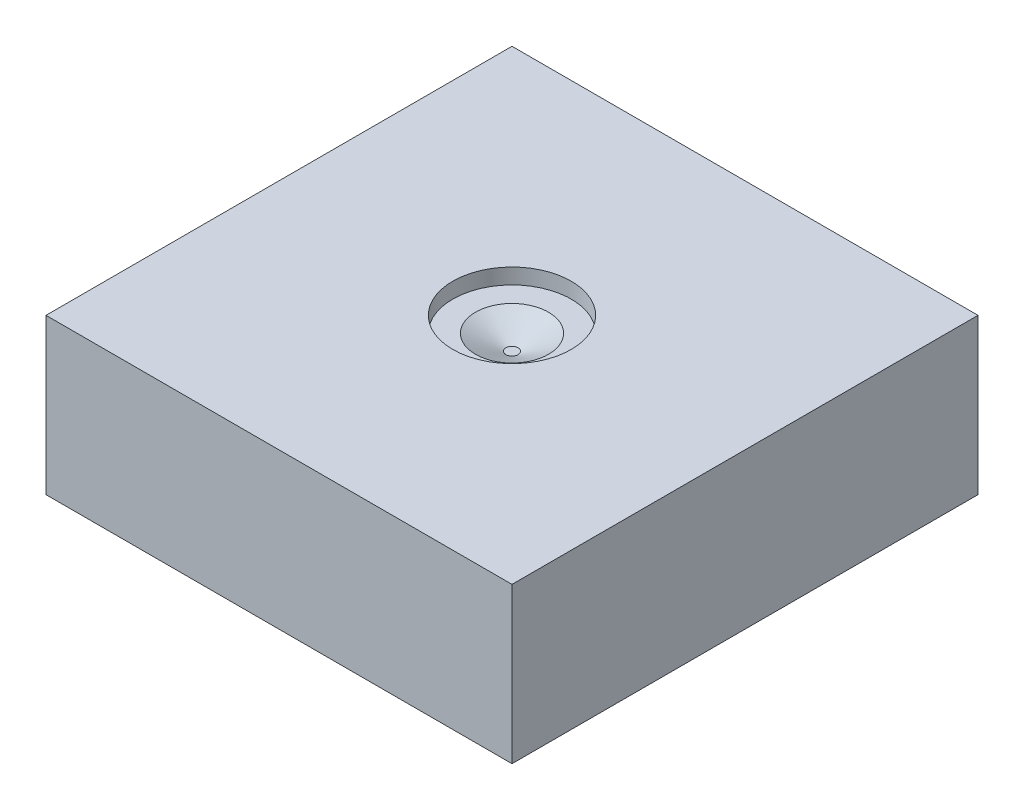
ISO-10303-21;
HEADER;
FILE_DESCRIPTION(('STEP AP214'),'2;1');
FILE_NAME('part.step','',(''),(''),'','','');
FILE_SCHEMA(('AUTOMOTIVE_DESIGN { 1 0 10303 214 1 1 1 1 }'));
ENDSEC;
DATA;
#1=APPLICATION_CONTEXT('core data for automotive mechanical design processes');
#2=APPLICATION_PROTOCOL_DEFINITION('international standard','automotive_design',2000,#1);
#3=PRODUCT_CONTEXT('',#1,'mechanical');
#4=PRODUCT('Part','Part','',(#3));
#5=PRODUCT_RELATED_PRODUCT_CATEGORY('part','',(#4));
#6=PRODUCT_DEFINITION_FORMATION('','',#4);
#7=PRODUCT_DEFINITION_CONTEXT('part definition',#1,'design');
#8=PRODUCT_DEFINITION('design','',#6,#7);
#9=PRODUCT_DEFINITION_SHAPE('','',#8);
#10=(LENGTH_UNIT() NAMED_UNIT(*) SI_UNIT(.MILLI.,.METRE.));
#11=(NAMED_UNIT(*) PLANE_ANGLE_UNIT() SI_UNIT($,.RADIAN.));
#12=(NAMED_UNIT(*) SI_UNIT($,.STERADIAN.) SOLID_ANGLE_UNIT());
#13=UNCERTAINTY_MEASURE_WITH_UNIT(LENGTH_MEASURE(1.E-05),#10,'distance_accuracy_value','');
#14=(GEOMETRIC_REPRESENTATION_CONTEXT(3) GLOBAL_UNCERTAINTY_ASSIGNED_CONTEXT((#13)) GLOBAL_UNIT_ASSIGNED_CONTEXT((#10,
#11,#12)) REPRESENTATION_CONTEXT('',''));
#15=CARTESIAN_POINT('',(0.,0.,0.));
#16=DIRECTION('',(0.,0.,1.));
#17=DIRECTION('',(1.,0.,0.));
#18=AXIS2_PLACEMENT_3D('',#15,#16,#17);
#19=CARTESIAN_POINT('',(-15.,10.,0.));
#20=DIRECTION('',(1.,0.,0.));
#21=DIRECTION('',(0.,0.,-1.));
#22=AXIS2_PLACEMENT_3D('',#19,#20,#21);
#23=PLANE('',#22);
#24=DIRECTION('',(0.,0.,1.));
#25=VECTOR('',#24,1.);
#26=CARTESIAN_POINT('',(-15.,0.,0.));
#27=LINE('',#26,#25);
#28=CARTESIAN_POINT('',(-15.,0.,-15.));
#29=VERTEX_POINT('',#28);
#30=CARTESIAN_POINT('',(-15.,0.,15.));
#31=VERTEX_POINT('',#30);
#32=EDGE_CURVE('E96',#29,#31,#27,.T.);
#33=ORIENTED_EDGE('',*,*,#32,.T.);
#34=DIRECTION('',(0.,-1.,0.));
#35=VECTOR('',#34,1.);
#36=CARTESIAN_POINT('',(-15.,10.,15.));
#37=LINE('',#36,#35);
#38=CARTESIAN_POINT('',(-15.,10.,15.));
#39=VERTEX_POINT('',#38);
#40=EDGE_CURVE('E11',#39,#31,#37,.T.);
#41=ORIENTED_EDGE('',*,*,#40,.F.);
#42=DIRECTION('',(0.,0.,1.));
#43=VECTOR('',#42,1.);
#44=CARTESIAN_POINT('',(-15.,10.,0.));
#45=LINE('',#44,#43);
#46=CARTESIAN_POINT('',(-15.,10.,-15.));
#47=VERTEX_POINT('',#46);
#48=EDGE_CURVE('E73',#47,#39,#45,.T.);
#49=ORIENTED_EDGE('',*,*,#48,.F.);
#50=DIRECTION('',(0.,-1.,0.));
#51=VECTOR('',#50,1.);
#52=CARTESIAN_POINT('',(-15.,10.,-15.));
#53=LINE('',#52,#51);
#54=EDGE_CURVE('E92',#47,#29,#53,.T.);
#55=ORIENTED_EDGE('',*,*,#54,.T.);
#56=EDGE_LOOP('',(#33,#41,#49,#55));
#57=FACE_BOUND('',#56,.T.);
#58=ADVANCED_FACE('F34',(#57),#23,.F.);
#59=CARTESIAN_POINT('',(0.,10.,15.));
#60=DIRECTION('',(0.,0.,1.));
#61=DIRECTION('',(1.,0.,0.));
#62=AXIS2_PLACEMENT_3D('',#59,#60,#61);
#63=PLANE('',#62);
#64=DIRECTION('',(-1.,0.,0.));
#65=VECTOR('',#64,1.);
#66=CARTESIAN_POINT('',(0.,0.,15.));
#67=LINE('',#66,#65);
#68=CARTESIAN_POINT('',(15.,0.,15.));
#69=VERTEX_POINT('',#68);
#70=EDGE_CURVE('E82',#69,#31,#67,.T.);
#71=ORIENTED_EDGE('',*,*,#70,.F.);
#72=DIRECTION('',(0.,-1.,0.));
#73=VECTOR('',#72,1.);
#74=CARTESIAN_POINT('',(15.,10.,15.));
#75=LINE('',#74,#73);
#76=CARTESIAN_POINT('',(15.,10.,15.));
#77=VERTEX_POINT('',#76);
#78=EDGE_CURVE('E42',#77,#69,#75,.T.);
#79=ORIENTED_EDGE('',*,*,#78,.F.);
#80=DIRECTION('',(-1.,0.,0.));
#81=VECTOR('',#80,1.);
#82=CARTESIAN_POINT('',(0.,10.,15.));
#83=LINE('',#82,#81);
#84=EDGE_CURVE('E80',#77,#39,#83,.T.);
#85=ORIENTED_EDGE('',*,*,#84,.T.);
#86=ORIENTED_EDGE('',*,*,#40,.T.);
#87=EDGE_LOOP('',(#71,#79,#85,#86));
#88=FACE_BOUND('',#87,.T.);
#89=ADVANCED_FACE('F79',(#88),#63,.T.);
#90=CARTESIAN_POINT('',(15.,10.,0.));
#91=DIRECTION('',(1.,0.,0.));
#92=DIRECTION('',(0.,0.,-1.));
#93=AXIS2_PLACEMENT_3D('',#90,#91,#92);
#94=PLANE('',#93);
#95=DIRECTION('',(0.,0.,1.));
#96=VECTOR('',#95,1.);
#97=CARTESIAN_POINT('',(15.,0.,0.));
#98=LINE('',#97,#96);
#99=CARTESIAN_POINT('',(15.,0.,-15.));
#100=VERTEX_POINT('',#99);
#101=EDGE_CURVE('E101',#100,#69,#98,.T.);
#102=ORIENTED_EDGE('',*,*,#101,.F.);
#103=DIRECTION('',(0.,-1.,0.));
#104=VECTOR('',#103,1.);
#105=CARTESIAN_POINT('',(15.,10.,-15.));
#106=LINE('',#105,#104);
#107=CARTESIAN_POINT('',(15.,10.,-15.));
#108=VERTEX_POINT('',#107);
#109=EDGE_CURVE('E65',#108,#100,#106,.T.);
#110=ORIENTED_EDGE('',*,*,#109,.F.);
#111=DIRECTION('',(0.,0.,1.));
#112=VECTOR('',#111,1.);
#113=CARTESIAN_POINT('',(15.,10.,0.));
#114=LINE('',#113,#112);
#115=EDGE_CURVE('E88',#108,#77,#114,.T.);
#116=ORIENTED_EDGE('',*,*,#115,.T.);
#117=ORIENTED_EDGE('',*,*,#78,.T.);
#118=EDGE_LOOP('',(#102,#110,#116,#117));
#119=FACE_BOUND('',#118,.T.);
#120=ADVANCED_FACE('F90',(#119),#94,.T.);
#121=CARTESIAN_POINT('',(0.,10.,-15.));
#122=DIRECTION('',(0.,0.,1.));
#123=DIRECTION('',(1.,0.,0.));
#124=AXIS2_PLACEMENT_3D('',#121,#122,#123);
#125=PLANE('',#124);
#126=DIRECTION('',(-1.,0.,0.));
#127=VECTOR('',#126,1.);
#128=CARTESIAN_POINT('',(0.,0.,-15.));
#129=LINE('',#128,#127);
#130=EDGE_CURVE('E68',#100,#29,#129,.T.);
#131=ORIENTED_EDGE('',*,*,#130,.T.);
#132=ORIENTED_EDGE('',*,*,#54,.F.);
#133=DIRECTION('',(-1.,0.,0.));
#134=VECTOR('',#133,1.);
#135=CARTESIAN_POINT('',(0.,10.,-15.));
#136=LINE('',#135,#134);
#137=EDGE_CURVE('E50',#108,#47,#136,.T.);
#138=ORIENTED_EDGE('',*,*,#137,.F.);
#139=ORIENTED_EDGE('',*,*,#109,.T.);
#140=EDGE_LOOP('',(#131,#132,#138,#139));
#141=FACE_BOUND('',#140,.T.);
#142=ADVANCED_FACE('F119',(#141),#125,.F.);
#143=CARTESIAN_POINT('',(0.,10.,0.));
#144=DIRECTION('',(0.,1.,0.));
#145=DIRECTION('',(0.,0.,1.));
#146=AXIS2_PLACEMENT_3D('',#143,#144,#145);
#147=PLANE('',#146);
#148=CARTESIAN_POINT('',(0.,10.,0.));
#149=DIRECTION('',(0.,1.,0.));
#150=DIRECTION('',(0.,0.,1.));
#151=AXIS2_PLACEMENT_3D('',#148,#149,#150);
#152=CIRCLE('',#151,3.81);
#153=CARTESIAN_POINT('',(0.,10.,3.81));
#154=VERTEX_POINT('',#153);
#155=EDGE_CURVE('E186',#154,#154,#152,.T.);
#156=ORIENTED_EDGE('',*,*,#155,.F.);
#157=EDGE_LOOP('',(#156));
#158=FACE_BOUND('',#157,.T.);
#159=ORIENTED_EDGE('',*,*,#48,.T.);
#160=ORIENTED_EDGE('',*,*,#84,.F.);
#161=ORIENTED_EDGE('',*,*,#115,.F.);
#162=ORIENTED_EDGE('',*,*,#137,.T.);
#163=EDGE_LOOP('',(#159,#160,#161,#162));
#164=FACE_BOUND('',#163,.T.);
#165=ADVANCED_FACE('F87',(#158,#164),#147,.T.);
#166=CARTESIAN_POINT('',(0.,0.,0.));
#167=DIRECTION('',(0.,1.,0.));
#168=DIRECTION('',(0.,0.,1.));
#169=AXIS2_PLACEMENT_3D('',#166,#167,#168);
#170=PLANE('',#169);
#171=ORIENTED_EDGE('',*,*,#32,.F.);
#172=ORIENTED_EDGE('',*,*,#130,.F.);
#173=ORIENTED_EDGE('',*,*,#101,.T.);
#174=ORIENTED_EDGE('',*,*,#70,.T.);
#175=EDGE_LOOP('',(#171,#172,#173,#174));
#176=FACE_BOUND('',#175,.T.);
#177=ADVANCED_FACE('F108',(#176),#170,.F.);
#178=CARTESIAN_POINT('',(0.,9.,0.));
#179=DIRECTION('',(0.,1.,0.));
#180=DIRECTION('',(0.,0.,1.));
#181=AXIS2_PLACEMENT_3D('',#178,#179,#180);
#182=CYLINDRICAL_SURFACE('',#181,3.81);
#183=CARTESIAN_POINT('',(0.,9.,0.));
#184=DIRECTION('',(0.,1.,0.));
#185=DIRECTION('',(0.,0.,1.));
#186=AXIS2_PLACEMENT_3D('',#183,#184,#185);
#187=CIRCLE('',#186,3.81);
#188=CARTESIAN_POINT('',(0.,9.,3.81));
#189=VERTEX_POINT('',#188);
#190=EDGE_CURVE('E99',#189,#189,#187,.T.);
#191=ORIENTED_EDGE('',*,*,#190,.F.);
#192=EDGE_LOOP('',(#191));
#193=FACE_BOUND('',#192,.T.);
#194=ORIENTED_EDGE('',*,*,#155,.T.);
#195=EDGE_LOOP('',(#194));
#196=FACE_BOUND('',#195,.T.);
#197=ADVANCED_FACE('F110',(#193,#196),#182,.F.);
#198=CARTESIAN_POINT('',(0.,9.,0.));
#199=DIRECTION('',(0.,1.,0.));
#200=DIRECTION('',(0.,0.,1.));
#201=AXIS2_PLACEMENT_3D('',#198,#199,#200);
#202=PLANE('',#201);
#203=CARTESIAN_POINT('',(0.,9.,0.));
#204=DIRECTION('',(0.,1.,0.));
#205=DIRECTION('',(0.,0.,1.));
#206=AXIS2_PLACEMENT_3D('',#203,#204,#205);
#207=CIRCLE('',#206,2.35);
#208=CARTESIAN_POINT('',(0.,9.,2.35));
#209=VERTEX_POINT('',#208);
#210=EDGE_CURVE('E187',#209,#209,#207,.T.);
#211=ORIENTED_EDGE('',*,*,#210,.F.);
#212=EDGE_LOOP('',(#211));
#213=FACE_BOUND('',#212,.T.);
#214=ORIENTED_EDGE('',*,*,#190,.T.);
#215=EDGE_LOOP('',(#214));
#216=FACE_BOUND('',#215,.T.);
#217=ADVANCED_FACE('F116',(#213,#216),#202,.T.);
#218=CARTESIAN_POINT('',(0.,9.,0.));
#219=DIRECTION('',(0.,1.,0.));
#220=DIRECTION('',(0.,0.,1.));
#221=AXIS2_PLACEMENT_3D('',#218,#219,#220);
#222=CONICAL_SURFACE('',#221,2.35,1.09955742875643);
#223=CARTESIAN_POINT('',(0.,8.,0.));
#224=DIRECTION('',(0.,1.,0.));
#225=DIRECTION('',(0.,0.,1.));
#226=AXIS2_PLACEMENT_3D('',#223,#224,#225);
#227=CIRCLE('',#226,0.387389494494836);
#228=CARTESIAN_POINT('',(0.,8.,0.387389494494835));
#229=VERTEX_POINT('',#228);
#230=EDGE_CURVE('E185',#229,#229,#227,.T.);
#231=CARTESIAN_POINT('',(0.,8.,0.387389494494835));
#232=CARTESIAN_POINT('',(0.,8.01041666666667,0.40783335392718));
#233=CARTESIAN_POINT('',(0.,8.02083333333333,0.428277213359525));
#234=CARTESIAN_POINT('',(0.,8.04166666666667,0.469164932224216));
#235=CARTESIAN_POINT('',(0.,8.05208333333333,0.489608791656562));
#236=CARTESIAN_POINT('',(0.,8.07291666666667,0.530496510521253));
#237=CARTESIAN_POINT('',(0.,8.08333333333333,0.550940369953598));
#238=CARTESIAN_POINT('',(0.,8.10416666666667,0.591828088818289));
#239=CARTESIAN_POINT('',(0.,8.11458333333333,0.612271948250635));
#240=CARTESIAN_POINT('',(0.,8.13541666666667,0.653159667115325));
#241=CARTESIAN_POINT('',(0.,8.14583333333333,0.673603526547671));
#242=CARTESIAN_POINT('',(0.,8.16666666666667,0.714491245412362));
#243=CARTESIAN_POINT('',(0.,8.17708333333333,0.734935104844707));
#244=CARTESIAN_POINT('',(0.,8.19791666666667,0.775822823709398));
#245=CARTESIAN_POINT('',(0.,8.20833333333333,0.796266683141744));
#246=CARTESIAN_POINT('',(0.,8.22916666666667,0.837154402006435));
#247=CARTESIAN_POINT('',(0.,8.23958333333333,0.85759826143878));
#248=CARTESIAN_POINT('',(0.,8.26041666666667,0.898485980303471));
#249=CARTESIAN_POINT('',(0.,8.27083333333333,0.918929839735816));
#250=CARTESIAN_POINT('',(0.,8.29166666666667,0.959817558600507));
#251=CARTESIAN_POINT('',(0.,8.30208333333333,0.980261418032853));
#252=CARTESIAN_POINT('',(0.,8.32291666666667,1.02114913689754));
#253=CARTESIAN_POINT('',(0.,8.33333333333333,1.04159299632989));
#254=CARTESIAN_POINT('',(0.,8.35416666666667,1.08248071519458));
#255=CARTESIAN_POINT('',(0.,8.36458333333333,1.10292457462693));
#256=CARTESIAN_POINT('',(0.,8.38541666666667,1.14381229349162));
#257=CARTESIAN_POINT('',(0.,8.39583333333333,1.16425615292396));
#258=CARTESIAN_POINT('',(0.,8.41666666666667,1.20514387178865));
#259=CARTESIAN_POINT('',(0.,8.42708333333333,1.225587731221));
#260=CARTESIAN_POINT('',(0.,8.44791666666667,1.26647545008569));
#261=CARTESIAN_POINT('',(0.,8.45833333333333,1.28691930951803));
#262=CARTESIAN_POINT('',(0.,8.47916666666667,1.32780702838273));
#263=CARTESIAN_POINT('',(0.,8.48958333333333,1.34825088781507));
#264=CARTESIAN_POINT('',(0.,8.51041666666667,1.38913860667976));
#265=CARTESIAN_POINT('',(0.,8.52083333333333,1.40958246611211));
#266=CARTESIAN_POINT('',(0.,8.54166666666667,1.4504701849768));
#267=CARTESIAN_POINT('',(0.,8.55208333333333,1.47091404440914));
#268=CARTESIAN_POINT('',(0.,8.57291666666667,1.51180176327383));
#269=CARTESIAN_POINT('',(0.,8.58333333333333,1.53224562270618));
#270=CARTESIAN_POINT('',(0.,8.60416666666667,1.57313334157087));
#271=CARTESIAN_POINT('',(0.,8.61458333333333,1.59357720100322));
#272=CARTESIAN_POINT('',(0.,8.63541666666667,1.63446491986791));
#273=CARTESIAN_POINT('',(0.,8.64583333333333,1.65490877930025));
#274=CARTESIAN_POINT('',(0.,8.66666666666667,1.69579649816494));
#275=CARTESIAN_POINT('',(0.,8.67708333333333,1.71624035759729));
#276=CARTESIAN_POINT('',(0.,8.69791666666667,1.75712807646198));
#277=CARTESIAN_POINT('',(0.,8.70833333333333,1.77757193589433));
#278=CARTESIAN_POINT('',(0.,8.72916666666667,1.81845965475902));
#279=CARTESIAN_POINT('',(0.,8.73958333333333,1.83890351419136));
#280=CARTESIAN_POINT('',(0.,8.76041666666667,1.87979123305605));
#281=CARTESIAN_POINT('',(0.,8.77083333333333,1.9002350924884));
#282=CARTESIAN_POINT('',(0.,8.79166666666667,1.94112281135309));
#283=CARTESIAN_POINT('',(0.,8.80208333333333,1.96156667078543));
#284=CARTESIAN_POINT('',(0.,8.82291666666667,2.00245438965013));
#285=CARTESIAN_POINT('',(0.,8.83333333333333,2.02289824908247));
#286=CARTESIAN_POINT('',(0.,8.85416666666667,2.06378596794716));
#287=CARTESIAN_POINT('',(0.,8.86458333333333,2.08422982737951));
#288=CARTESIAN_POINT('',(0.,8.88541666666667,2.1251175462442));
#289=CARTESIAN_POINT('',(0.,8.89583333333333,2.14556140567654));
#290=CARTESIAN_POINT('',(0.,8.91666666666667,2.18644912454123));
#291=CARTESIAN_POINT('',(0.,8.92708333333333,2.20689298397358));
#292=CARTESIAN_POINT('',(0.,8.94791666666667,2.24778070283827));
#293=CARTESIAN_POINT('',(0.,8.95833333333333,2.26822456227062));
#294=CARTESIAN_POINT('',(0.,8.97916666666667,2.30911228113531));
#295=CARTESIAN_POINT('',(0.,8.98958333333333,2.32955614056765));
#296=CARTESIAN_POINT('',(0.,9.,2.35));
#297=B_SPLINE_CURVE_WITH_KNOTS('',3,(#231,#232,#233,#234,#235,#236,#237,#238,#239,#240,#241,
#242,#243,#244,#245,#246,#247,#248,#249,#250,#251,#252,#253,#254,#255,#256,#257,#258,#259,#260,
#261,#262,#263,#264,#265,#266,#267,#268,#269,#270,#271,#272,#273,#274,#275,#276,#277,#278,#279,
#280,#281,#282,#283,#284,#285,#286,#287,#288,#289,#290,#291,#292,#293,#294,#295,#296),
.UNSPECIFIED.,.F.,.F.,(4,2,2,2,2,2,2,2,2,2,2,2,2,2,2,2,2,2,2,2,2,2,2,2,2,2,2,2,2,2,2,2,4),(0.,
0.0688340395182899,0.13766807903658,0.20650211855487,0.27533615807316,0.34417019759145,
0.41300423710974,0.48183827662803,0.55067231614632,0.61950635566461,0.6883403951829,
0.75717443470119,0.82600847421948,0.89484251373777,0.96367655325606,1.03251059277435,
1.10134463229264,1.17017867181093,1.23901271132922,1.30784675084751,1.3766807903658,
1.44551482988409,1.51434886940238,1.58318290892067,1.65201694843896,1.72085098795725,
1.78968502747554,1.85851906699383,1.92735310651212,1.99618714603041,2.0650211855487,
2.13385522506699,2.20268926458528),.UNSPECIFIED.);
#298=EDGE_CURVE('BSEAM159',#229,#209,#297,.T.);
#299=ORIENTED_EDGE('',*,*,#230,.F.);
#300=ORIENTED_EDGE('',*,*,#210,.T.);
#301=ORIENTED_EDGE('',*,*,#298,.T.);
#302=ORIENTED_EDGE('',*,*,#298,.F.);
#303=EDGE_LOOP('',(#299,#301,#300,#302));
#304=FACE_BOUND('',#303,.T.);
#305=ADVANCED_FACE('F159',(#304),#222,.F.);
#306=CARTESIAN_POINT('',(0.,8.,0.));
#307=DIRECTION('',(0.,1.,0.));
#308=DIRECTION('',(0.,0.,1.));
#309=AXIS2_PLACEMENT_3D('',#306,#307,#308);
#310=PLANE('',#309);
#311=ORIENTED_EDGE('',*,*,#230,.T.);
#312=EDGE_LOOP('',(#311));
#313=FACE_BOUND('',#312,.T.);
#314=ADVANCED_FACE('F169',(#313),#310,.T.);
#315=CLOSED_SHELL('',(#58,#89,#120,#142,#165,#177,#197,#217,#305,#314));
#316=MANIFOLD_SOLID_BREP('B2',#315);
#317=ADVANCED_BREP_SHAPE_REPRESENTATION('',(#18,#316),#14);
#318=SHAPE_DEFINITION_REPRESENTATION(#9,#317);
ENDSEC;
END-ISO-10303-21;
